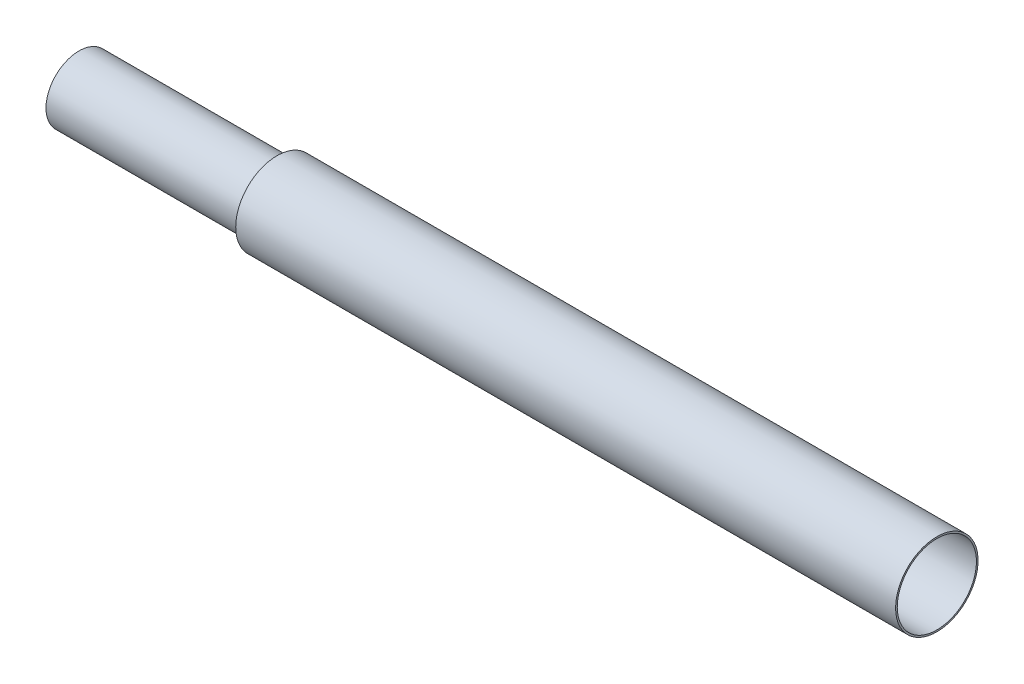
ISO-10303-21;
HEADER;
FILE_DESCRIPTION(('STEP AP214'),'2;1');
FILE_NAME('part.step','',(''),(''),'','','');
FILE_SCHEMA(('AUTOMOTIVE_DESIGN { 1 0 10303 214 1 1 1 1 }'));
ENDSEC;
DATA;
#1=APPLICATION_CONTEXT('core data for automotive mechanical design processes');
#2=APPLICATION_PROTOCOL_DEFINITION('international standard','automotive_design',2000,#1);
#3=PRODUCT_CONTEXT('',#1,'mechanical');
#4=PRODUCT('Part','Part','',(#3));
#5=PRODUCT_RELATED_PRODUCT_CATEGORY('part','',(#4));
#6=PRODUCT_DEFINITION_FORMATION('','',#4);
#7=PRODUCT_DEFINITION_CONTEXT('part definition',#1,'design');
#8=PRODUCT_DEFINITION('design','',#6,#7);
#9=PRODUCT_DEFINITION_SHAPE('','',#8);
#10=(LENGTH_UNIT() NAMED_UNIT(*) SI_UNIT(.MILLI.,.METRE.));
#11=(NAMED_UNIT(*) PLANE_ANGLE_UNIT() SI_UNIT($,.RADIAN.));
#12=(NAMED_UNIT(*) SI_UNIT($,.STERADIAN.) SOLID_ANGLE_UNIT());
#13=UNCERTAINTY_MEASURE_WITH_UNIT(LENGTH_MEASURE(1.E-05),#10,'distance_accuracy_value','');
#14=(GEOMETRIC_REPRESENTATION_CONTEXT(3) GLOBAL_UNCERTAINTY_ASSIGNED_CONTEXT((#13)) GLOBAL_UNIT_ASSIGNED_CONTEXT((#10,
#11,#12)) REPRESENTATION_CONTEXT('',''));
#15=CARTESIAN_POINT('',(0.,0.,0.));
#16=DIRECTION('',(0.,0.,1.));
#17=DIRECTION('',(1.,0.,0.));
#18=AXIS2_PLACEMENT_3D('',#15,#16,#17);
#19=CARTESIAN_POINT('',(0.,0.,0.));
#20=DIRECTION('',(-1.,0.,0.));
#21=DIRECTION('',(0.,0.,1.));
#22=AXIS2_PLACEMENT_3D('',#19,#20,#21);
#23=CYLINDRICAL_SURFACE('',#22,240.);
#24=CARTESIAN_POINT('',(5200.,0.,0.));
#25=DIRECTION('',(-1.,0.,0.));
#26=DIRECTION('',(0.,0.,1.));
#27=AXIS2_PLACEMENT_3D('',#24,#25,#26);
#28=CIRCLE('',#27,240.);
#29=CARTESIAN_POINT('',(5200.,0.,240.));
#30=VERTEX_POINT('',#29);
#31=EDGE_CURVE('E62',#30,#30,#28,.T.);
#32=ORIENTED_EDGE('',*,*,#31,.F.);
#33=EDGE_LOOP('',(#32));
#34=FACE_BOUND('',#33,.T.);
#35=CARTESIAN_POINT('',(1210.,0.,0.));
#36=DIRECTION('',(-1.,0.,0.));
#37=DIRECTION('',(0.,0.,1.));
#38=AXIS2_PLACEMENT_3D('',#35,#36,#37);
#39=CIRCLE('',#38,240.);
#40=CARTESIAN_POINT('',(1210.,0.,240.));
#41=VERTEX_POINT('',#40);
#42=EDGE_CURVE('E10',#41,#41,#39,.T.);
#43=ORIENTED_EDGE('',*,*,#42,.T.);
#44=EDGE_LOOP('',(#43));
#45=FACE_BOUND('',#44,.T.);
#46=ADVANCED_FACE('F34',(#34,#45),#23,.F.);
#47=CARTESIAN_POINT('',(1210.,200.,0.));
#48=DIRECTION('',(-1.,0.,0.));
#49=DIRECTION('',(0.,0.,1.));
#50=AXIS2_PLACEMENT_3D('',#47,#48,#49);
#51=PLANE('',#50);
#52=ORIENTED_EDGE('',*,*,#42,.F.);
#53=EDGE_LOOP('',(#52));
#54=FACE_BOUND('',#53,.T.);
#55=CARTESIAN_POINT('',(1210.,0.,0.));
#56=DIRECTION('',(-1.,0.,0.));
#57=DIRECTION('',(0.,0.,1.));
#58=AXIS2_PLACEMENT_3D('',#55,#56,#57);
#59=CIRCLE('',#58,190.);
#60=CARTESIAN_POINT('',(1210.,0.,190.));
#61=VERTEX_POINT('',#60);
#62=EDGE_CURVE('E40',#61,#61,#59,.T.);
#63=ORIENTED_EDGE('',*,*,#62,.T.);
#64=EDGE_LOOP('',(#63));
#65=FACE_BOUND('',#64,.T.);
#66=ADVANCED_FACE('F70',(#54,#65),#51,.F.);
#67=CARTESIAN_POINT('',(0.,0.,0.));
#68=DIRECTION('',(-1.,0.,0.));
#69=DIRECTION('',(0.,0.,1.));
#70=AXIS2_PLACEMENT_3D('',#67,#68,#69);
#71=CYLINDRICAL_SURFACE('',#70,190.);
#72=ORIENTED_EDGE('',*,*,#62,.F.);
#73=EDGE_LOOP('',(#72));
#74=FACE_BOUND('',#73,.T.);
#75=CARTESIAN_POINT('',(0.,0.,0.));
#76=DIRECTION('',(-1.,0.,0.));
#77=DIRECTION('',(0.,0.,1.));
#78=AXIS2_PLACEMENT_3D('',#75,#76,#77);
#79=CIRCLE('',#78,190.);
#80=CARTESIAN_POINT('',(0.,0.,190.));
#81=VERTEX_POINT('',#80);
#82=EDGE_CURVE('E44',#81,#81,#79,.T.);
#83=ORIENTED_EDGE('',*,*,#82,.T.);
#84=EDGE_LOOP('',(#83));
#85=FACE_BOUND('',#84,.T.);
#86=ADVANCED_FACE('F74',(#74,#85),#71,.F.);
#87=CARTESIAN_POINT('',(0.,190.,0.));
#88=DIRECTION('',(-1.,0.,0.));
#89=DIRECTION('',(0.,0.,1.));
#90=AXIS2_PLACEMENT_3D('',#87,#88,#89);
#91=PLANE('',#90);
#92=CARTESIAN_POINT('',(0.,0.,0.));
#93=DIRECTION('',(-1.,0.,0.));
#94=DIRECTION('',(0.,0.,1.));
#95=AXIS2_PLACEMENT_3D('',#92,#93,#94);
#96=CIRCLE('',#95,200.);
#97=CARTESIAN_POINT('',(0.,0.,200.));
#98=VERTEX_POINT('',#97);
#99=EDGE_CURVE('E48',#98,#98,#96,.T.);
#100=ORIENTED_EDGE('',*,*,#99,.T.);
#101=EDGE_LOOP('',(#100));
#102=FACE_BOUND('',#101,.T.);
#103=ORIENTED_EDGE('',*,*,#82,.F.);
#104=EDGE_LOOP('',(#103));
#105=FACE_BOUND('',#104,.T.);
#106=ADVANCED_FACE('F79',(#102,#105),#91,.T.);
#107=CARTESIAN_POINT('',(0.,0.,0.));
#108=DIRECTION('',(-1.,0.,0.));
#109=DIRECTION('',(0.,0.,1.));
#110=AXIS2_PLACEMENT_3D('',#107,#108,#109);
#111=CYLINDRICAL_SURFACE('',#110,200.);
#112=CARTESIAN_POINT('',(1200.,0.,0.));
#113=DIRECTION('',(-1.,0.,0.));
#114=DIRECTION('',(0.,0.,1.));
#115=AXIS2_PLACEMENT_3D('',#112,#113,#114);
#116=CIRCLE('',#115,200.);
#117=CARTESIAN_POINT('',(1200.,0.,200.));
#118=VERTEX_POINT('',#117);
#119=EDGE_CURVE('E53',#118,#118,#116,.T.);
#120=ORIENTED_EDGE('',*,*,#119,.T.);
#121=EDGE_LOOP('',(#120));
#122=FACE_BOUND('',#121,.T.);
#123=ORIENTED_EDGE('',*,*,#99,.F.);
#124=EDGE_LOOP('',(#123));
#125=FACE_BOUND('',#124,.T.);
#126=ADVANCED_FACE('F85',(#122,#125),#111,.T.);
#127=CARTESIAN_POINT('',(1200.,200.,0.));
#128=DIRECTION('',(-1.,0.,0.));
#129=DIRECTION('',(0.,0.,1.));
#130=AXIS2_PLACEMENT_3D('',#127,#128,#129);
#131=PLANE('',#130);
#132=CARTESIAN_POINT('',(1200.,0.,0.));
#133=DIRECTION('',(-1.,0.,0.));
#134=DIRECTION('',(0.,0.,1.));
#135=AXIS2_PLACEMENT_3D('',#132,#133,#134);
#136=CIRCLE('',#135,250.);
#137=CARTESIAN_POINT('',(1200.,0.,250.));
#138=VERTEX_POINT('',#137);
#139=EDGE_CURVE('E56',#138,#138,#136,.T.);
#140=ORIENTED_EDGE('',*,*,#139,.T.);
#141=EDGE_LOOP('',(#140));
#142=FACE_BOUND('',#141,.T.);
#143=ORIENTED_EDGE('',*,*,#119,.F.);
#144=EDGE_LOOP('',(#143));
#145=FACE_BOUND('',#144,.T.);
#146=ADVANCED_FACE('F89',(#142,#145),#131,.T.);
#147=CARTESIAN_POINT('',(0.,0.,0.));
#148=DIRECTION('',(-1.,0.,0.));
#149=DIRECTION('',(0.,0.,1.));
#150=AXIS2_PLACEMENT_3D('',#147,#148,#149);
#151=CYLINDRICAL_SURFACE('',#150,250.);
#152=CARTESIAN_POINT('',(5200.,0.,0.));
#153=DIRECTION('',(-1.,0.,0.));
#154=DIRECTION('',(0.,0.,1.));
#155=AXIS2_PLACEMENT_3D('',#152,#153,#154);
#156=CIRCLE('',#155,250.);
#157=CARTESIAN_POINT('',(5200.,0.,250.));
#158=VERTEX_POINT('',#157);
#159=EDGE_CURVE('E59',#158,#158,#156,.T.);
#160=ORIENTED_EDGE('',*,*,#159,.T.);
#161=EDGE_LOOP('',(#160));
#162=FACE_BOUND('',#161,.T.);
#163=ORIENTED_EDGE('',*,*,#139,.F.);
#164=EDGE_LOOP('',(#163));
#165=FACE_BOUND('',#164,.T.);
#166=ADVANCED_FACE('F93',(#162,#165),#151,.T.);
#167=CARTESIAN_POINT('',(5200.,250.,0.));
#168=DIRECTION('',(1.,0.,0.));
#169=DIRECTION('',(0.,0.,-1.));
#170=AXIS2_PLACEMENT_3D('',#167,#168,#169);
#171=PLANE('',#170);
#172=ORIENTED_EDGE('',*,*,#31,.T.);
#173=EDGE_LOOP('',(#172));
#174=FACE_BOUND('',#173,.T.);
#175=ORIENTED_EDGE('',*,*,#159,.F.);
#176=EDGE_LOOP('',(#175));
#177=FACE_BOUND('',#176,.T.);
#178=ADVANCED_FACE('F66',(#174,#177),#171,.T.);
#179=CLOSED_SHELL('',(#46,#66,#86,#106,#126,#146,#166,#178));
#180=MANIFOLD_SOLID_BREP('B2',#179);
#181=ADVANCED_BREP_SHAPE_REPRESENTATION('',(#18,#180),#14);
#182=SHAPE_DEFINITION_REPRESENTATION(#9,#181);
ENDSEC;
END-ISO-10303-21;
